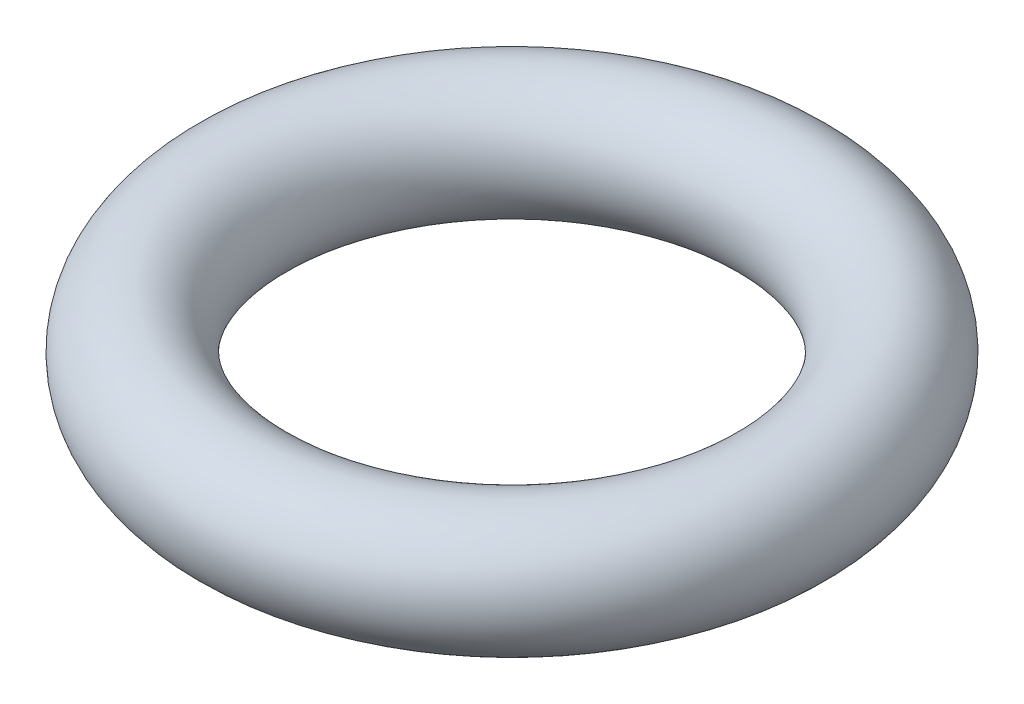
ISO-10303-21;
HEADER;
FILE_DESCRIPTION(('STEP AP214'),'2;1');
FILE_NAME('part.step','',(''),(''),'','','');
FILE_SCHEMA(('AUTOMOTIVE_DESIGN { 1 0 10303 214 1 1 1 1 }'));
ENDSEC;
DATA;
#1=APPLICATION_CONTEXT('core data for automotive mechanical design processes');
#2=APPLICATION_PROTOCOL_DEFINITION('international standard','automotive_design',2000,#1);
#3=PRODUCT_CONTEXT('',#1,'mechanical');
#4=PRODUCT('Part','Part','',(#3));
#5=PRODUCT_RELATED_PRODUCT_CATEGORY('part','',(#4));
#6=PRODUCT_DEFINITION_FORMATION('','',#4);
#7=PRODUCT_DEFINITION_CONTEXT('part definition',#1,'design');
#8=PRODUCT_DEFINITION('design','',#6,#7);
#9=PRODUCT_DEFINITION_SHAPE('','',#8);
#10=(LENGTH_UNIT() NAMED_UNIT(*) SI_UNIT(.MILLI.,.METRE.));
#11=(NAMED_UNIT(*) PLANE_ANGLE_UNIT() SI_UNIT($,.RADIAN.));
#12=(NAMED_UNIT(*) SI_UNIT($,.STERADIAN.) SOLID_ANGLE_UNIT());
#13=UNCERTAINTY_MEASURE_WITH_UNIT(LENGTH_MEASURE(1.E-05),#10,'distance_accuracy_value','');
#14=(GEOMETRIC_REPRESENTATION_CONTEXT(3) GLOBAL_UNCERTAINTY_ASSIGNED_CONTEXT((#13)) GLOBAL_UNIT_ASSIGNED_CONTEXT((#10,
#11,#12)) REPRESENTATION_CONTEXT('',''));
#15=CARTESIAN_POINT('',(0.,0.,0.));
#16=DIRECTION('',(0.,0.,1.));
#17=DIRECTION('',(1.,0.,0.));
#18=AXIS2_PLACEMENT_3D('',#15,#16,#17);
#19=CARTESIAN_POINT('',(0.,0.,0.));
#20=DIRECTION('',(0.,-1.,0.));
#21=DIRECTION('',(0.,0.,-1.));
#22=AXIS2_PLACEMENT_3D('',#19,#20,#21);
#23=TOROIDAL_SURFACE('',#22,5.5,1.25);
#24=CARTESIAN_POINT('',(0.,0.,-6.75));
#25=VERTEX_POINT('',#24);
#26=VERTEX_LOOP('',#25);
#27=FACE_BOUND('',#26,.T.);
#28=ADVANCED_FACE('F30',(#27),#23,.T.);
#29=CLOSED_SHELL('',(#28));
#30=MANIFOLD_SOLID_BREP('B2',#29);
#31=ADVANCED_BREP_SHAPE_REPRESENTATION('',(#18,#30),#14);
#32=SHAPE_DEFINITION_REPRESENTATION(#9,#31);
ENDSEC;
END-ISO-10303-21;
